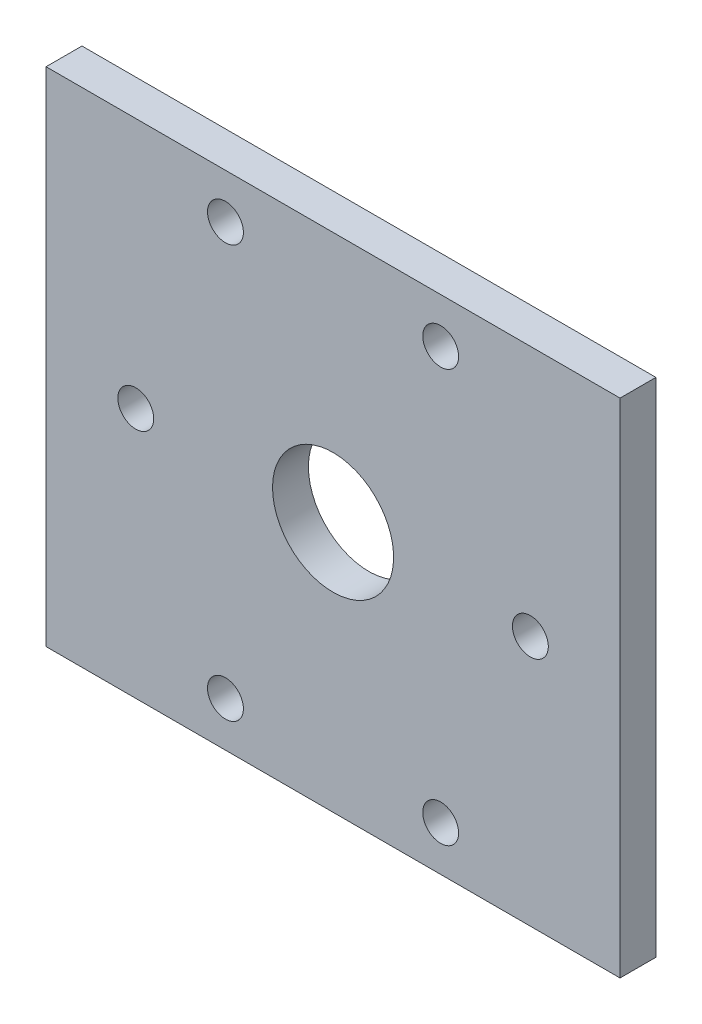
ISO-10303-21;
HEADER;
FILE_DESCRIPTION(('STEP AP214'),'2;1');
FILE_NAME('part.step','',(''),(''),'','','');
FILE_SCHEMA(('AUTOMOTIVE_DESIGN { 1 0 10303 214 1 1 1 1 }'));
ENDSEC;
DATA;
#1=APPLICATION_CONTEXT('core data for automotive mechanical design processes');
#2=APPLICATION_PROTOCOL_DEFINITION('international standard','automotive_design',2000,#1);
#3=PRODUCT_CONTEXT('',#1,'mechanical');
#4=PRODUCT('Part','Part','',(#3));
#5=PRODUCT_RELATED_PRODUCT_CATEGORY('part','',(#4));
#6=PRODUCT_DEFINITION_FORMATION('','',#4);
#7=PRODUCT_DEFINITION_CONTEXT('part definition',#1,'design');
#8=PRODUCT_DEFINITION('design','',#6,#7);
#9=PRODUCT_DEFINITION_SHAPE('','',#8);
#10=(LENGTH_UNIT() NAMED_UNIT(*) SI_UNIT(.MILLI.,.METRE.));
#11=(NAMED_UNIT(*) PLANE_ANGLE_UNIT() SI_UNIT($,.RADIAN.));
#12=(NAMED_UNIT(*) SI_UNIT($,.STERADIAN.) SOLID_ANGLE_UNIT());
#13=UNCERTAINTY_MEASURE_WITH_UNIT(LENGTH_MEASURE(1.E-05),#10,'distance_accuracy_value','');
#14=(GEOMETRIC_REPRESENTATION_CONTEXT(3) GLOBAL_UNCERTAINTY_ASSIGNED_CONTEXT((#13)) GLOBAL_UNIT_ASSIGNED_CONTEXT((#10,
#11,#12)) REPRESENTATION_CONTEXT('',''));
#15=CARTESIAN_POINT('',(0.,0.,0.));
#16=DIRECTION('',(0.,0.,1.));
#17=DIRECTION('',(1.,0.,0.));
#18=AXIS2_PLACEMENT_3D('',#15,#16,#17);
#19=CARTESIAN_POINT('',(0.,0.,4.));
#20=DIRECTION('',(0.,0.,1.));
#21=DIRECTION('',(1.,0.,0.));
#22=AXIS2_PLACEMENT_3D('',#19,#20,#21);
#23=PLANE('',#22);
#24=CARTESIAN_POINT('',(-22.,0.,4.));
#25=DIRECTION('',(0.,0.,-1.));
#26=DIRECTION('',(-1.,0.,0.));
#27=AXIS2_PLACEMENT_3D('',#24,#25,#26);
#28=CIRCLE('',#27,2.);
#29=CARTESIAN_POINT('',(-24.,0.,4.));
#30=VERTEX_POINT('',#29);
#31=EDGE_CURVE('E145',#30,#30,#28,.T.);
#32=ORIENTED_EDGE('',*,*,#31,.T.);
#33=EDGE_LOOP('',(#32));
#34=FACE_BOUND('',#33,.T.);
#35=CARTESIAN_POINT('',(22.,0.,4.));
#36=DIRECTION('',(0.,0.,-1.));
#37=DIRECTION('',(-1.,0.,0.));
#38=AXIS2_PLACEMENT_3D('',#35,#36,#37);
#39=CIRCLE('',#38,2.);
#40=CARTESIAN_POINT('',(20.,0.,4.));
#41=VERTEX_POINT('',#40);
#42=EDGE_CURVE('E139',#41,#41,#39,.T.);
#43=ORIENTED_EDGE('',*,*,#42,.T.);
#44=EDGE_LOOP('',(#43));
#45=FACE_BOUND('',#44,.T.);
#46=CARTESIAN_POINT('',(0.,0.,4.));
#47=DIRECTION('',(0.,0.,-1.));
#48=DIRECTION('',(-1.,0.,0.));
#49=AXIS2_PLACEMENT_3D('',#46,#47,#48);
#50=CIRCLE('',#49,6.75);
#51=CARTESIAN_POINT('',(-6.75,0.,4.));
#52=VERTEX_POINT('',#51);
#53=EDGE_CURVE('E133',#52,#52,#50,.T.);
#54=ORIENTED_EDGE('',*,*,#53,.T.);
#55=EDGE_LOOP('',(#54));
#56=FACE_BOUND('',#55,.T.);
#57=CARTESIAN_POINT('',(-12.,-23.,4.));
#58=DIRECTION('',(0.,0.,1.));
#59=DIRECTION('',(1.,0.,0.));
#60=AXIS2_PLACEMENT_3D('',#57,#58,#59);
#61=CIRCLE('',#60,2.);
#62=CARTESIAN_POINT('',(-10.,-23.,4.));
#63=VERTEX_POINT('',#62);
#64=EDGE_CURVE('E121',#63,#63,#61,.T.);
#65=ORIENTED_EDGE('',*,*,#64,.F.);
#66=EDGE_LOOP('',(#65));
#67=FACE_BOUND('',#66,.T.);
#68=CARTESIAN_POINT('',(-12.,23.,4.));
#69=DIRECTION('',(0.,0.,1.));
#70=DIRECTION('',(1.,0.,0.));
#71=AXIS2_PLACEMENT_3D('',#68,#69,#70);
#72=CIRCLE('',#71,2.);
#73=CARTESIAN_POINT('',(-9.99999999999999,23.,4.));
#74=VERTEX_POINT('',#73);
#75=EDGE_CURVE('E100',#74,#74,#72,.T.);
#76=ORIENTED_EDGE('',*,*,#75,.F.);
#77=EDGE_LOOP('',(#76));
#78=FACE_BOUND('',#77,.T.);
#79=DIRECTION('',(0.,-1.,0.));
#80=VECTOR('',#79,1.);
#81=CARTESIAN_POINT('',(-32.,28.,4.));
#82=LINE('',#81,#80);
#83=CARTESIAN_POINT('',(-32.,28.,4.));
#84=VERTEX_POINT('',#83);
#85=CARTESIAN_POINT('',(-32.,-28.,4.));
#86=VERTEX_POINT('',#85);
#87=EDGE_CURVE('E85',#84,#86,#82,.T.);
#88=ORIENTED_EDGE('',*,*,#87,.T.);
#89=DIRECTION('',(1.,0.,0.));
#90=VECTOR('',#89,1.);
#91=CARTESIAN_POINT('',(-32.,-28.,4.));
#92=LINE('',#91,#90);
#93=CARTESIAN_POINT('',(32.,-28.,4.));
#94=VERTEX_POINT('',#93);
#95=EDGE_CURVE('E80',#86,#94,#92,.T.);
#96=ORIENTED_EDGE('',*,*,#95,.T.);
#97=DIRECTION('',(0.,1.,0.));
#98=VECTOR('',#97,1.);
#99=CARTESIAN_POINT('',(32.,28.,4.));
#100=LINE('',#99,#98);
#101=CARTESIAN_POINT('',(32.,28.,4.));
#102=VERTEX_POINT('',#101);
#103=EDGE_CURVE('E83',#94,#102,#100,.T.);
#104=ORIENTED_EDGE('',*,*,#103,.T.);
#105=DIRECTION('',(-1.,0.,0.));
#106=VECTOR('',#105,1.);
#107=CARTESIAN_POINT('',(-32.,28.,4.));
#108=LINE('',#107,#106);
#109=EDGE_CURVE('E50',#102,#84,#108,.T.);
#110=ORIENTED_EDGE('',*,*,#109,.T.);
#111=EDGE_LOOP('',(#88,#96,#104,#110));
#112=FACE_BOUND('',#111,.T.);
#113=CARTESIAN_POINT('',(12.,23.,4.));
#114=DIRECTION('',(0.,0.,1.));
#115=DIRECTION('',(1.,0.,0.));
#116=AXIS2_PLACEMENT_3D('',#113,#114,#115);
#117=CIRCLE('',#116,2.);
#118=CARTESIAN_POINT('',(14.,23.,4.));
#119=VERTEX_POINT('',#118);
#120=EDGE_CURVE('E115',#119,#119,#117,.T.);
#121=ORIENTED_EDGE('',*,*,#120,.F.);
#122=EDGE_LOOP('',(#121));
#123=FACE_BOUND('',#122,.T.);
#124=CARTESIAN_POINT('',(12.,-23.,4.));
#125=DIRECTION('',(0.,0.,1.));
#126=DIRECTION('',(1.,0.,0.));
#127=AXIS2_PLACEMENT_3D('',#124,#125,#126);
#128=CIRCLE('',#127,2.);
#129=CARTESIAN_POINT('',(14.,-23.,4.));
#130=VERTEX_POINT('',#129);
#131=EDGE_CURVE('E127',#130,#130,#128,.T.);
#132=ORIENTED_EDGE('',*,*,#131,.F.);
#133=EDGE_LOOP('',(#132));
#134=FACE_BOUND('',#133,.T.);
#135=ADVANCED_FACE('F33',(#34,#45,#56,#67,#78,#112,#123,#134),#23,.T.);
#136=CARTESIAN_POINT('',(0.,0.,0.));
#137=DIRECTION('',(0.,0.,1.));
#138=DIRECTION('',(1.,0.,0.));
#139=AXIS2_PLACEMENT_3D('',#136,#137,#138);
#140=PLANE('',#139);
#141=CARTESIAN_POINT('',(-22.,0.,0.));
#142=DIRECTION('',(0.,0.,-1.));
#143=DIRECTION('',(-1.,0.,0.));
#144=AXIS2_PLACEMENT_3D('',#141,#142,#143);
#145=CIRCLE('',#144,2.);
#146=CARTESIAN_POINT('',(-24.,0.,0.));
#147=VERTEX_POINT('',#146);
#148=EDGE_CURVE('E148',#147,#147,#145,.T.);
#149=ORIENTED_EDGE('',*,*,#148,.F.);
#150=EDGE_LOOP('',(#149));
#151=FACE_BOUND('',#150,.T.);
#152=CARTESIAN_POINT('',(22.,0.,0.));
#153=DIRECTION('',(0.,0.,-1.));
#154=DIRECTION('',(-1.,0.,0.));
#155=AXIS2_PLACEMENT_3D('',#152,#153,#154);
#156=CIRCLE('',#155,2.);
#157=CARTESIAN_POINT('',(20.,0.,0.));
#158=VERTEX_POINT('',#157);
#159=EDGE_CURVE('E142',#158,#158,#156,.T.);
#160=ORIENTED_EDGE('',*,*,#159,.F.);
#161=EDGE_LOOP('',(#160));
#162=FACE_BOUND('',#161,.T.);
#163=CARTESIAN_POINT('',(0.,0.,0.));
#164=DIRECTION('',(0.,0.,-1.));
#165=DIRECTION('',(-1.,0.,0.));
#166=AXIS2_PLACEMENT_3D('',#163,#164,#165);
#167=CIRCLE('',#166,6.75);
#168=CARTESIAN_POINT('',(-6.75,0.,0.));
#169=VERTEX_POINT('',#168);
#170=EDGE_CURVE('E136',#169,#169,#167,.T.);
#171=ORIENTED_EDGE('',*,*,#170,.F.);
#172=EDGE_LOOP('',(#171));
#173=FACE_BOUND('',#172,.T.);
#174=DIRECTION('',(0.,-1.,0.));
#175=VECTOR('',#174,1.);
#176=CARTESIAN_POINT('',(-32.,28.,0.));
#177=LINE('',#176,#175);
#178=CARTESIAN_POINT('',(-32.,28.,0.));
#179=VERTEX_POINT('',#178);
#180=CARTESIAN_POINT('',(-32.,-28.,0.));
#181=VERTEX_POINT('',#180);
#182=EDGE_CURVE('E97',#179,#181,#177,.T.);
#183=ORIENTED_EDGE('',*,*,#182,.F.);
#184=DIRECTION('',(-1.,0.,0.));
#185=VECTOR('',#184,1.);
#186=CARTESIAN_POINT('',(-32.,28.,0.));
#187=LINE('',#186,#185);
#188=CARTESIAN_POINT('',(32.,28.,0.));
#189=VERTEX_POINT('',#188);
#190=EDGE_CURVE('E73',#189,#179,#187,.T.);
#191=ORIENTED_EDGE('',*,*,#190,.F.);
#192=DIRECTION('',(0.,1.,0.));
#193=VECTOR('',#192,1.);
#194=CARTESIAN_POINT('',(32.,28.,0.));
#195=LINE('',#194,#193);
#196=CARTESIAN_POINT('',(32.,-28.,0.));
#197=VERTEX_POINT('',#196);
#198=EDGE_CURVE('E67',#197,#189,#195,.T.);
#199=ORIENTED_EDGE('',*,*,#198,.F.);
#200=DIRECTION('',(1.,0.,0.));
#201=VECTOR('',#200,1.);
#202=CARTESIAN_POINT('',(-32.,-28.,0.));
#203=LINE('',#202,#201);
#204=EDGE_CURVE('E89',#181,#197,#203,.T.);
#205=ORIENTED_EDGE('',*,*,#204,.F.);
#206=EDGE_LOOP('',(#183,#191,#199,#205));
#207=FACE_BOUND('',#206,.T.);
#208=CARTESIAN_POINT('',(-12.,23.,0.));
#209=DIRECTION('',(0.,0.,1.));
#210=DIRECTION('',(1.,0.,0.));
#211=AXIS2_PLACEMENT_3D('',#208,#209,#210);
#212=CIRCLE('',#211,2.);
#213=CARTESIAN_POINT('',(-9.99999999999999,23.,0.));
#214=VERTEX_POINT('',#213);
#215=EDGE_CURVE('E112',#214,#214,#212,.T.);
#216=ORIENTED_EDGE('',*,*,#215,.T.);
#217=EDGE_LOOP('',(#216));
#218=FACE_BOUND('',#217,.T.);
#219=CARTESIAN_POINT('',(12.,23.,0.));
#220=DIRECTION('',(0.,0.,1.));
#221=DIRECTION('',(1.,0.,0.));
#222=AXIS2_PLACEMENT_3D('',#219,#220,#221);
#223=CIRCLE('',#222,2.);
#224=CARTESIAN_POINT('',(14.,23.,0.));
#225=VERTEX_POINT('',#224);
#226=EDGE_CURVE('E118',#225,#225,#223,.T.);
#227=ORIENTED_EDGE('',*,*,#226,.T.);
#228=EDGE_LOOP('',(#227));
#229=FACE_BOUND('',#228,.T.);
#230=CARTESIAN_POINT('',(-12.,-23.,0.));
#231=DIRECTION('',(0.,0.,1.));
#232=DIRECTION('',(1.,0.,0.));
#233=AXIS2_PLACEMENT_3D('',#230,#231,#232);
#234=CIRCLE('',#233,2.);
#235=CARTESIAN_POINT('',(-10.,-23.,0.));
#236=VERTEX_POINT('',#235);
#237=EDGE_CURVE('E124',#236,#236,#234,.T.);
#238=ORIENTED_EDGE('',*,*,#237,.T.);
#239=EDGE_LOOP('',(#238));
#240=FACE_BOUND('',#239,.T.);
#241=CARTESIAN_POINT('',(12.,-23.,0.));
#242=DIRECTION('',(0.,0.,1.));
#243=DIRECTION('',(1.,0.,0.));
#244=AXIS2_PLACEMENT_3D('',#241,#242,#243);
#245=CIRCLE('',#244,2.);
#246=CARTESIAN_POINT('',(14.,-23.,0.));
#247=VERTEX_POINT('',#246);
#248=EDGE_CURVE('E130',#247,#247,#245,.T.);
#249=ORIENTED_EDGE('',*,*,#248,.T.);
#250=EDGE_LOOP('',(#249));
#251=FACE_BOUND('',#250,.T.);
#252=ADVANCED_FACE('F108',(#151,#162,#173,#207,#218,#229,#240,#251),#140,.F.);
#253=CARTESIAN_POINT('',(-32.,28.,4.));
#254=DIRECTION('',(1.,0.,0.));
#255=DIRECTION('',(0.,0.,-1.));
#256=AXIS2_PLACEMENT_3D('',#253,#254,#255);
#257=PLANE('',#256);
#258=ORIENTED_EDGE('',*,*,#182,.T.);
#259=DIRECTION('',(0.,0.,-1.));
#260=VECTOR('',#259,1.);
#261=CARTESIAN_POINT('',(-32.,-28.,4.));
#262=LINE('',#261,#260);
#263=EDGE_CURVE('E11',#86,#181,#262,.T.);
#264=ORIENTED_EDGE('',*,*,#263,.F.);
#265=ORIENTED_EDGE('',*,*,#87,.F.);
#266=DIRECTION('',(0.,0.,-1.));
#267=VECTOR('',#266,1.);
#268=CARTESIAN_POINT('',(-32.,28.,4.));
#269=LINE('',#268,#267);
#270=EDGE_CURVE('E93',#84,#179,#269,.T.);
#271=ORIENTED_EDGE('',*,*,#270,.T.);
#272=EDGE_LOOP('',(#258,#264,#265,#271));
#273=FACE_BOUND('',#272,.T.);
#274=ADVANCED_FACE('F35',(#273),#257,.F.);
#275=CARTESIAN_POINT('',(-32.,-28.,4.));
#276=DIRECTION('',(0.,1.,0.));
#277=DIRECTION('',(0.,0.,1.));
#278=AXIS2_PLACEMENT_3D('',#275,#276,#277);
#279=PLANE('',#278);
#280=ORIENTED_EDGE('',*,*,#204,.T.);
#281=DIRECTION('',(0.,0.,-1.));
#282=VECTOR('',#281,1.);
#283=CARTESIAN_POINT('',(32.,-28.,4.));
#284=LINE('',#283,#282);
#285=EDGE_CURVE('E42',#94,#197,#284,.T.);
#286=ORIENTED_EDGE('',*,*,#285,.F.);
#287=ORIENTED_EDGE('',*,*,#95,.F.);
#288=ORIENTED_EDGE('',*,*,#263,.T.);
#289=EDGE_LOOP('',(#280,#286,#287,#288));
#290=FACE_BOUND('',#289,.T.);
#291=ADVANCED_FACE('F88',(#290),#279,.F.);
#292=CARTESIAN_POINT('',(32.,28.,4.));
#293=DIRECTION('',(-1.,0.,0.));
#294=DIRECTION('',(0.,0.,1.));
#295=AXIS2_PLACEMENT_3D('',#292,#293,#294);
#296=PLANE('',#295);
#297=ORIENTED_EDGE('',*,*,#198,.T.);
#298=DIRECTION('',(0.,0.,-1.));
#299=VECTOR('',#298,1.);
#300=CARTESIAN_POINT('',(32.,28.,4.));
#301=LINE('',#300,#299);
#302=EDGE_CURVE('E90',#102,#189,#301,.T.);
#303=ORIENTED_EDGE('',*,*,#302,.F.);
#304=ORIENTED_EDGE('',*,*,#103,.F.);
#305=ORIENTED_EDGE('',*,*,#285,.T.);
#306=EDGE_LOOP('',(#297,#303,#304,#305));
#307=FACE_BOUND('',#306,.T.);
#308=ADVANCED_FACE('F91',(#307),#296,.F.);
#309=CARTESIAN_POINT('',(-32.,28.,4.));
#310=DIRECTION('',(0.,-1.,0.));
#311=DIRECTION('',(0.,0.,-1.));
#312=AXIS2_PLACEMENT_3D('',#309,#310,#311);
#313=PLANE('',#312);
#314=ORIENTED_EDGE('',*,*,#190,.T.);
#315=ORIENTED_EDGE('',*,*,#270,.F.);
#316=ORIENTED_EDGE('',*,*,#109,.F.);
#317=ORIENTED_EDGE('',*,*,#302,.T.);
#318=EDGE_LOOP('',(#314,#315,#316,#317));
#319=FACE_BOUND('',#318,.T.);
#320=ADVANCED_FACE('F105',(#319),#313,.F.);
#321=CARTESIAN_POINT('',(-12.,23.,4.));
#322=DIRECTION('',(0.,0.,-1.));
#323=DIRECTION('',(-1.,0.,0.));
#324=AXIS2_PLACEMENT_3D('',#321,#322,#323);
#325=CYLINDRICAL_SURFACE('',#324,2.);
#326=ORIENTED_EDGE('',*,*,#75,.T.);
#327=EDGE_LOOP('',(#326));
#328=FACE_BOUND('',#327,.T.);
#329=ORIENTED_EDGE('',*,*,#215,.F.);
#330=EDGE_LOOP('',(#329));
#331=FACE_BOUND('',#330,.T.);
#332=ADVANCED_FACE('F190',(#328,#331),#325,.F.);
#333=CARTESIAN_POINT('',(12.,23.,4.));
#334=DIRECTION('',(0.,0.,-1.));
#335=DIRECTION('',(-1.,0.,0.));
#336=AXIS2_PLACEMENT_3D('',#333,#334,#335);
#337=CYLINDRICAL_SURFACE('',#336,2.);
#338=ORIENTED_EDGE('',*,*,#120,.T.);
#339=EDGE_LOOP('',(#338));
#340=FACE_BOUND('',#339,.T.);
#341=ORIENTED_EDGE('',*,*,#226,.F.);
#342=EDGE_LOOP('',(#341));
#343=FACE_BOUND('',#342,.T.);
#344=ADVANCED_FACE('F241',(#340,#343),#337,.F.);
#345=CARTESIAN_POINT('',(-12.,-23.,4.));
#346=DIRECTION('',(0.,0.,-1.));
#347=DIRECTION('',(-1.,0.,0.));
#348=AXIS2_PLACEMENT_3D('',#345,#346,#347);
#349=CYLINDRICAL_SURFACE('',#348,2.);
#350=ORIENTED_EDGE('',*,*,#64,.T.);
#351=EDGE_LOOP('',(#350));
#352=FACE_BOUND('',#351,.T.);
#353=ORIENTED_EDGE('',*,*,#237,.F.);
#354=EDGE_LOOP('',(#353));
#355=FACE_BOUND('',#354,.T.);
#356=ADVANCED_FACE('F181',(#352,#355),#349,.F.);
#357=CARTESIAN_POINT('',(12.,-23.,4.));
#358=DIRECTION('',(0.,0.,-1.));
#359=DIRECTION('',(-1.,0.,0.));
#360=AXIS2_PLACEMENT_3D('',#357,#358,#359);
#361=CYLINDRICAL_SURFACE('',#360,2.);
#362=ORIENTED_EDGE('',*,*,#131,.T.);
#363=EDGE_LOOP('',(#362));
#364=FACE_BOUND('',#363,.T.);
#365=ORIENTED_EDGE('',*,*,#248,.F.);
#366=EDGE_LOOP('',(#365));
#367=FACE_BOUND('',#366,.T.);
#368=ADVANCED_FACE('F172',(#364,#367),#361,.F.);
#369=CARTESIAN_POINT('',(0.,0.,4.));
#370=DIRECTION('',(0.,0.,-1.));
#371=DIRECTION('',(-1.,0.,0.));
#372=AXIS2_PLACEMENT_3D('',#369,#370,#371);
#373=CYLINDRICAL_SURFACE('',#372,6.75);
#374=ORIENTED_EDGE('',*,*,#53,.F.);
#375=EDGE_LOOP('',(#374));
#376=FACE_BOUND('',#375,.T.);
#377=ORIENTED_EDGE('',*,*,#170,.T.);
#378=EDGE_LOOP('',(#377));
#379=FACE_BOUND('',#378,.T.);
#380=ADVANCED_FACE('F170',(#376,#379),#373,.F.);
#381=CARTESIAN_POINT('',(22.,0.,4.));
#382=DIRECTION('',(0.,0.,-1.));
#383=DIRECTION('',(-1.,0.,0.));
#384=AXIS2_PLACEMENT_3D('',#381,#382,#383);
#385=CYLINDRICAL_SURFACE('',#384,2.);
#386=ORIENTED_EDGE('',*,*,#42,.F.);
#387=EDGE_LOOP('',(#386));
#388=FACE_BOUND('',#387,.T.);
#389=ORIENTED_EDGE('',*,*,#159,.T.);
#390=EDGE_LOOP('',(#389));
#391=FACE_BOUND('',#390,.T.);
#392=ADVANCED_FACE('F159',(#388,#391),#385,.F.);
#393=CARTESIAN_POINT('',(-22.,0.,4.));
#394=DIRECTION('',(0.,0.,-1.));
#395=DIRECTION('',(-1.,0.,0.));
#396=AXIS2_PLACEMENT_3D('',#393,#394,#395);
#397=CYLINDRICAL_SURFACE('',#396,2.);
#398=ORIENTED_EDGE('',*,*,#31,.F.);
#399=EDGE_LOOP('',(#398));
#400=FACE_BOUND('',#399,.T.);
#401=ORIENTED_EDGE('',*,*,#148,.T.);
#402=EDGE_LOOP('',(#401));
#403=FACE_BOUND('',#402,.T.);
#404=ADVANCED_FACE('F156',(#400,#403),#397,.F.);
#405=CLOSED_SHELL('',(#135,#252,#274,#291,#308,#320,#332,#344,#356,#368,#380,#392,#404));
#406=MANIFOLD_SOLID_BREP('B2',#405);
#407=ADVANCED_BREP_SHAPE_REPRESENTATION('',(#18,#406),#14);
#408=SHAPE_DEFINITION_REPRESENTATION(#9,#407);
ENDSEC;
END-ISO-10303-21;
